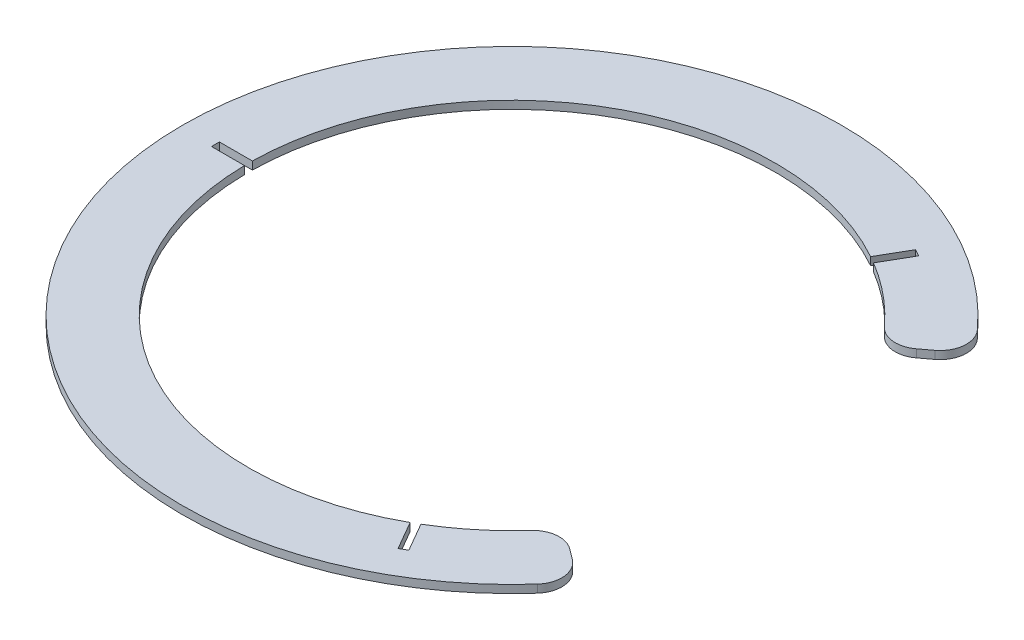
ISO-10303-21;
HEADER;
FILE_DESCRIPTION(('STEP AP214'),'2;1');
FILE_NAME('part.step','',(''),(''),'','','');
FILE_SCHEMA(('AUTOMOTIVE_DESIGN { 1 0 10303 214 1 1 1 1 }'));
ENDSEC;
DATA;
#1=APPLICATION_CONTEXT('core data for automotive mechanical design processes');
#2=APPLICATION_PROTOCOL_DEFINITION('international standard','automotive_design',2000,#1);
#3=PRODUCT_CONTEXT('',#1,'mechanical');
#4=PRODUCT('Part','Part','',(#3));
#5=PRODUCT_RELATED_PRODUCT_CATEGORY('part','',(#4));
#6=PRODUCT_DEFINITION_FORMATION('','',#4);
#7=PRODUCT_DEFINITION_CONTEXT('part definition',#1,'design');
#8=PRODUCT_DEFINITION('design','',#6,#7);
#9=PRODUCT_DEFINITION_SHAPE('','',#8);
#10=(LENGTH_UNIT() NAMED_UNIT(*) SI_UNIT(.MILLI.,.METRE.));
#11=(NAMED_UNIT(*) PLANE_ANGLE_UNIT() SI_UNIT($,.RADIAN.));
#12=(NAMED_UNIT(*) SI_UNIT($,.STERADIAN.) SOLID_ANGLE_UNIT());
#13=UNCERTAINTY_MEASURE_WITH_UNIT(LENGTH_MEASURE(1.E-05),#10,'distance_accuracy_value','');
#14=(GEOMETRIC_REPRESENTATION_CONTEXT(3) GLOBAL_UNCERTAINTY_ASSIGNED_CONTEXT((#13)) GLOBAL_UNIT_ASSIGNED_CONTEXT((#10,
#11,#12)) REPRESENTATION_CONTEXT('',''));
#15=CARTESIAN_POINT('',(0.,0.,0.));
#16=DIRECTION('',(0.,0.,1.));
#17=DIRECTION('',(1.,0.,0.));
#18=AXIS2_PLACEMENT_3D('',#15,#16,#17);
#19=CARTESIAN_POINT('',(0.,0.,0.));
#20=DIRECTION('',(0.,1.,0.));
#21=DIRECTION('',(0.,0.,1.));
#22=AXIS2_PLACEMENT_3D('',#19,#20,#21);
#23=CYLINDRICAL_SURFACE('',#22,100.);
#24=CARTESIAN_POINT('',(0.,0.,0.));
#25=DIRECTION('',(0.,1.,0.));
#26=DIRECTION('',(0.,0.,1.));
#27=AXIS2_PLACEMENT_3D('',#24,#25,#26);
#28=CIRCLE('',#27,100.);
#29=CARTESIAN_POINT('',(74.2141901825696,0.,-67.0242790005636));
#30=VERTEX_POINT('',#29);
#31=CARTESIAN_POINT('',(51.293412789234,0.,-85.8427970445584));
#32=VERTEX_POINT('',#31);
#33=EDGE_CURVE('E256',#30,#32,#28,.T.);
#34=ORIENTED_EDGE('',*,*,#33,.F.);
#35=DIRECTION('',(0.,1.,0.));
#36=VECTOR('',#35,1.);
#37=CARTESIAN_POINT('',(74.2141901825696,0.,-67.0242790005636));
#38=LINE('',#37,#36);
#39=CARTESIAN_POINT('',(74.2141901825696,3.,-67.0242790005636));
#40=VERTEX_POINT('',#39);
#41=EDGE_CURVE('E11',#30,#40,#38,.T.);
#42=ORIENTED_EDGE('',*,*,#41,.T.);
#43=CARTESIAN_POINT('',(0.,3.,0.));
#44=DIRECTION('',(0.,1.,0.));
#45=DIRECTION('',(0.,0.,1.));
#46=AXIS2_PLACEMENT_3D('',#43,#44,#45);
#47=CIRCLE('',#46,100.);
#48=CARTESIAN_POINT('',(51.293412789234,3.,-85.8427970445584));
#49=VERTEX_POINT('',#48);
#50=EDGE_CURVE('E262',#40,#49,#47,.T.);
#51=ORIENTED_EDGE('',*,*,#50,.T.);
#52=DIRECTION('',(0.,1.,0.));
#53=VECTOR('',#52,1.);
#54=CARTESIAN_POINT('',(51.293412789234,0.,-85.8427970445584));
#55=LINE('',#54,#53);
#56=EDGE_CURVE('E277',#49,#32,#55,.F.);
#57=ORIENTED_EDGE('',*,*,#56,.T.);
#58=EDGE_LOOP('',(#34,#42,#51,#57));
#59=FACE_BOUND('',#58,.T.);
#60=ADVANCED_FACE('F33',(#59),#23,.F.);
#61=CARTESIAN_POINT('',(-99.9887493671163,3.,1.5));
#62=VERTEX_POINT('',#61);
#63=CARTESIAN_POINT('',(48.6953365778819,3.,87.3427970445577));
#64=VERTEX_POINT('',#63);
#65=EDGE_CURVE('E257',#62,#64,#47,.T.);
#66=ORIENTED_EDGE('',*,*,#65,.T.);
#67=DIRECTION('',(0.,1.,0.));
#68=VECTOR('',#67,1.);
#69=CARTESIAN_POINT('',(48.6953365778819,0.,87.3427970445577));
#70=LINE('',#69,#68);
#71=CARTESIAN_POINT('',(48.6953365778819,0.,87.3427970445577));
#72=VERTEX_POINT('',#71);
#73=EDGE_CURVE('E281',#64,#72,#70,.F.);
#74=ORIENTED_EDGE('',*,*,#73,.T.);
#75=CARTESIAN_POINT('',(-99.9887493671163,0.,1.5));
#76=VERTEX_POINT('',#75);
#77=EDGE_CURVE('E252',#76,#72,#28,.T.);
#78=ORIENTED_EDGE('',*,*,#77,.F.);
#79=DIRECTION('',(0.,1.,0.));
#80=VECTOR('',#79,1.);
#81=CARTESIAN_POINT('',(-99.9887493671163,0.,1.5));
#82=LINE('',#81,#80);
#83=EDGE_CURVE('E266',#76,#62,#82,.T.);
#84=ORIENTED_EDGE('',*,*,#83,.T.);
#85=EDGE_LOOP('',(#66,#74,#78,#84));
#86=FACE_BOUND('',#85,.T.);
#87=ADVANCED_FACE('F380',(#86),#23,.F.);
#88=CARTESIAN_POINT('',(51.2934127892352,3.,85.8427970445577));
#89=VERTEX_POINT('',#88);
#90=CARTESIAN_POINT('',(74.2073939229752,3.,67.0318035499596));
#91=VERTEX_POINT('',#90);
#92=EDGE_CURVE('E261',#89,#91,#47,.T.);
#93=ORIENTED_EDGE('',*,*,#92,.T.);
#94=DIRECTION('',(0.,1.,0.));
#95=VECTOR('',#94,1.);
#96=CARTESIAN_POINT('',(74.2073939229752,0.,67.0318035499596));
#97=LINE('',#96,#95);
#98=CARTESIAN_POINT('',(74.2073939229752,0.,67.0318035499596));
#99=VERTEX_POINT('',#98);
#100=EDGE_CURVE('E297',#91,#99,#97,.F.);
#101=ORIENTED_EDGE('',*,*,#100,.T.);
#102=CARTESIAN_POINT('',(51.2934127892352,0.,85.8427970445577));
#103=VERTEX_POINT('',#102);
#104=EDGE_CURVE('E255',#103,#99,#28,.T.);
#105=ORIENTED_EDGE('',*,*,#104,.F.);
#106=DIRECTION('',(0.,1.,0.));
#107=VECTOR('',#106,1.);
#108=CARTESIAN_POINT('',(51.2934127892352,0.,85.8427970445577));
#109=LINE('',#108,#107);
#110=EDGE_CURVE('E190',#103,#89,#109,.T.);
#111=ORIENTED_EDGE('',*,*,#110,.T.);
#112=EDGE_LOOP('',(#93,#101,#105,#111));
#113=FACE_BOUND('',#112,.T.);
#114=ADVANCED_FACE('F387',(#113),#23,.F.);
#115=CARTESIAN_POINT('',(0.,3.,0.));
#116=DIRECTION('',(0.,-1.,0.));
#117=DIRECTION('',(0.,0.,-1.));
#118=AXIS2_PLACEMENT_3D('',#115,#116,#117);
#119=CYLINDRICAL_SURFACE('',#118,125.);
#120=CARTESIAN_POINT('',(0.,0.,0.));
#121=DIRECTION('',(0.,1.,0.));
#122=DIRECTION('',(0.,0.,1.));
#123=AXIS2_PLACEMENT_3D('',#120,#121,#122);
#124=CIRCLE('',#123,125.);
#125=CARTESIAN_POINT('',(93.0994716294748,0.,-83.4115602438452));
#126=VERTEX_POINT('',#125);
#127=CARTESIAN_POINT('',(93.0871330036378,0.,83.4253299014337));
#128=VERTEX_POINT('',#127);
#129=EDGE_CURVE('E254',#126,#128,#124,.T.);
#130=ORIENTED_EDGE('',*,*,#129,.T.);
#131=DIRECTION('',(0.,-1.,0.));
#132=VECTOR('',#131,1.);
#133=CARTESIAN_POINT('',(93.0871330036378,3.,83.4253299014337));
#134=LINE('',#133,#132);
#135=CARTESIAN_POINT('',(93.0871330036378,3.,83.4253299014337));
#136=VERTEX_POINT('',#135);
#137=EDGE_CURVE('E308',#128,#136,#134,.F.);
#138=ORIENTED_EDGE('',*,*,#137,.T.);
#139=CARTESIAN_POINT('',(0.,3.,0.));
#140=DIRECTION('',(0.,1.,0.));
#141=DIRECTION('',(0.,0.,1.));
#142=AXIS2_PLACEMENT_3D('',#139,#140,#141);
#143=CIRCLE('',#142,125.);
#144=CARTESIAN_POINT('',(93.0994716294748,3.,-83.4115602438452));
#145=VERTEX_POINT('',#144);
#146=EDGE_CURVE('E263',#145,#136,#143,.T.);
#147=ORIENTED_EDGE('',*,*,#146,.F.);
#148=DIRECTION('',(0.,-1.,0.));
#149=VECTOR('',#148,1.);
#150=CARTESIAN_POINT('',(93.0994716294748,3.,-83.4115602438452));
#151=LINE('',#150,#149);
#152=EDGE_CURVE('E306',#145,#126,#151,.T.);
#153=ORIENTED_EDGE('',*,*,#152,.T.);
#154=EDGE_LOOP('',(#130,#138,#147,#153));
#155=FACE_BOUND('',#154,.T.);
#156=ADVANCED_FACE('F370',(#155),#119,.T.);
#157=CARTESIAN_POINT('',(0.,3.,0.));
#158=DIRECTION('',(0.,1.,0.));
#159=DIRECTION('',(0.,0.,1.));
#160=AXIS2_PLACEMENT_3D('',#157,#158,#159);
#161=PLANE('',#160);
#162=DIRECTION('',(0.799301578633206,0.,0.600930101088691));
#163=VECTOR('',#162,1.);
#164=CARTESIAN_POINT('',(80.,3.,60.));
#165=LINE('',#164,#163);
#166=CARTESIAN_POINT('',(87.6374343261596,3.,65.7419681186235));
#167=VERTEX_POINT('',#166);
#168=CARTESIAN_POINT('',(91.6494633742337,3.,68.7582877229869));
#169=VERTEX_POINT('',#168);
#170=EDGE_CURVE('E323',#167,#169,#165,.T.);
#171=ORIENTED_EDGE('',*,*,#170,.F.);
#172=CARTESIAN_POINT('',(81.6281333152727,3.,73.7349839049556));
#173=DIRECTION('',(0.,1.,0.));
#174=DIRECTION('',(0.,0.,1.));
#175=AXIS2_PLACEMENT_3D('',#172,#173,#174);
#176=CIRCLE('',#175,10.);
#177=EDGE_CURVE('E295',#167,#91,#176,.T.);
#178=ORIENTED_EDGE('',*,*,#177,.T.);
#179=ORIENTED_EDGE('',*,*,#92,.F.);
#180=DIRECTION('',(-0.500000000000004,0.,-0.866025403784436));
#181=VECTOR('',#180,1.);
#182=CARTESIAN_POINT('',(45.049038105677,3.,75.0272228311382));
#183=LINE('',#182,#181);
#184=CARTESIAN_POINT('',(57.5490381056771,3.,96.6778579257491));
#185=VERTEX_POINT('',#184);
#186=EDGE_CURVE('E198',#185,#89,#183,.T.);
#187=ORIENTED_EDGE('',*,*,#186,.F.);
#188=DIRECTION('',(0.866025403784436,0.,-0.500000000000004));
#189=VECTOR('',#188,1.);
#190=CARTESIAN_POINT('',(57.5490381056771,3.,96.6778579257491));
#191=LINE('',#190,#189);
#192=CARTESIAN_POINT('',(54.9509618943238,3.,98.1778579257491));
#193=VERTEX_POINT('',#192);
#194=EDGE_CURVE('E180',#193,#185,#191,.T.);
#195=ORIENTED_EDGE('',*,*,#194,.F.);
#196=DIRECTION('',(0.500000000000004,0.,0.866025403784436));
#197=VECTOR('',#196,1.);
#198=CARTESIAN_POINT('',(42.4509618943237,3.,76.5272228311382));
#199=LINE('',#198,#197);
#200=EDGE_CURVE('E196',#64,#193,#199,.T.);
#201=ORIENTED_EDGE('',*,*,#200,.F.);
#202=ORIENTED_EDGE('',*,*,#65,.F.);
#203=DIRECTION('',(1.,0.,0.));
#204=VECTOR('',#203,1.);
#205=CARTESIAN_POINT('',(-87.5,3.,1.5));
#206=LINE('',#205,#204);
#207=CARTESIAN_POINT('',(-112.5,3.,1.5));
#208=VERTEX_POINT('',#207);
#209=EDGE_CURVE('E244',#208,#62,#206,.T.);
#210=ORIENTED_EDGE('',*,*,#209,.F.);
#211=DIRECTION('',(0.,0.,1.));
#212=VECTOR('',#211,1.);
#213=CARTESIAN_POINT('',(-112.5,3.,1.5));
#214=LINE('',#213,#212);
#215=CARTESIAN_POINT('',(-112.5,3.,-1.5));
#216=VERTEX_POINT('',#215);
#217=EDGE_CURVE('E208',#216,#208,#214,.T.);
#218=ORIENTED_EDGE('',*,*,#217,.F.);
#219=DIRECTION('',(-1.,0.,0.));
#220=VECTOR('',#219,1.);
#221=CARTESIAN_POINT('',(-87.5,3.,-1.5));
#222=LINE('',#221,#220);
#223=CARTESIAN_POINT('',(-99.9887493671163,3.,-1.5));
#224=VERTEX_POINT('',#223);
#225=EDGE_CURVE('E235',#224,#216,#222,.T.);
#226=ORIENTED_EDGE('',*,*,#225,.F.);
#227=CARTESIAN_POINT('',(48.6953365778807,3.,-87.3427970445584));
#228=VERTEX_POINT('',#227);
#229=EDGE_CURVE('E250',#228,#224,#47,.T.);
#230=ORIENTED_EDGE('',*,*,#229,.F.);
#231=DIRECTION('',(-0.499999999999992,0.,0.866025403784443));
#232=VECTOR('',#231,1.);
#233=CARTESIAN_POINT('',(42.4509618943226,3.,-76.5272228311388));
#234=LINE('',#233,#232);
#235=CARTESIAN_POINT('',(54.9509618943224,3.,-98.1778579257499));
#236=VERTEX_POINT('',#235);
#237=EDGE_CURVE('E224',#236,#228,#234,.T.);
#238=ORIENTED_EDGE('',*,*,#237,.F.);
#239=DIRECTION('',(-0.866025403784443,0.,-0.499999999999992));
#240=VECTOR('',#239,1.);
#241=CARTESIAN_POINT('',(54.9509618943224,3.,-98.1778579257499));
#242=LINE('',#241,#240);
#243=CARTESIAN_POINT('',(57.5490381056758,3.,-96.6778579257499));
#244=VERTEX_POINT('',#243);
#245=EDGE_CURVE('E221',#244,#236,#242,.T.);
#246=ORIENTED_EDGE('',*,*,#245,.F.);
#247=DIRECTION('',(0.499999999999992,0.,-0.866025403784443));
#248=VECTOR('',#247,1.);
#249=CARTESIAN_POINT('',(45.049038105676,3.,-75.0272228311388));
#250=LINE('',#249,#248);
#251=EDGE_CURVE('E214',#49,#244,#250,.T.);
#252=ORIENTED_EDGE('',*,*,#251,.F.);
#253=ORIENTED_EDGE('',*,*,#50,.F.);
#254=CARTESIAN_POINT('',(81.6356092008266,3.,-73.7267069006199));
#255=DIRECTION('',(0.,1.,0.));
#256=DIRECTION('',(0.,0.,1.));
#257=AXIS2_PLACEMENT_3D('',#254,#255,#256);
#258=CIRCLE('',#257,10.);
#259=CARTESIAN_POINT('',(87.6356092008266,3.,-65.7267069006199));
#260=VERTEX_POINT('',#259);
#261=EDGE_CURVE('E289',#40,#260,#258,.T.);
#262=ORIENTED_EDGE('',*,*,#261,.T.);
#263=DIRECTION('',(-0.8,0.,0.6));
#264=VECTOR('',#263,1.);
#265=CARTESIAN_POINT('',(80.,3.,-60.));
#266=LINE('',#265,#264);
#267=CARTESIAN_POINT('',(91.6515138991168,3.,-68.7386354243376));
#268=VERTEX_POINT('',#267);
#269=EDGE_CURVE('E201',#268,#260,#266,.T.);
#270=ORIENTED_EDGE('',*,*,#269,.F.);
#271=CARTESIAN_POINT('',(85.6515138991168,3.,-76.7386354243376));
#272=DIRECTION('',(0.,1.,0.));
#273=DIRECTION('',(0.,0.,1.));
#274=AXIS2_PLACEMENT_3D('',#271,#272,#273);
#275=CIRCLE('',#274,10.);
#276=EDGE_CURVE('E291',#268,#145,#275,.T.);
#277=ORIENTED_EDGE('',*,*,#276,.T.);
#278=ORIENTED_EDGE('',*,*,#146,.T.);
#279=CARTESIAN_POINT('',(85.6401623633468,3.,76.751303509319));
#280=DIRECTION('',(0.,1.,0.));
#281=DIRECTION('',(0.,0.,1.));
#282=AXIS2_PLACEMENT_3D('',#279,#280,#281);
#283=CIRCLE('',#282,10.);
#284=EDGE_CURVE('E293',#136,#169,#283,.T.);
#285=ORIENTED_EDGE('',*,*,#284,.T.);
#286=EDGE_LOOP('',(#171,#178,#179,#187,#195,#201,#202,#210,#218,#226,#230,#238,#246,#252,#253,
#262,#270,#277,#278,#285));
#287=FACE_BOUND('',#286,.T.);
#288=ADVANCED_FACE('F319',(#287),#161,.T.);
#289=CARTESIAN_POINT('',(0.,0.,0.));
#290=DIRECTION('',(0.,1.,0.));
#291=DIRECTION('',(0.,0.,1.));
#292=AXIS2_PLACEMENT_3D('',#289,#290,#291);
#293=PLANE('',#292);
#294=ORIENTED_EDGE('',*,*,#104,.T.);
#295=CARTESIAN_POINT('',(81.6281333152727,0.,73.7349839049556));
#296=DIRECTION('',(0.,1.,0.));
#297=DIRECTION('',(0.,0.,1.));
#298=AXIS2_PLACEMENT_3D('',#295,#296,#297);
#299=CIRCLE('',#298,10.);
#300=CARTESIAN_POINT('',(87.6374343261596,0.,65.7419681186235));
#301=VERTEX_POINT('',#300);
#302=EDGE_CURVE('E304',#99,#301,#299,.F.);
#303=ORIENTED_EDGE('',*,*,#302,.T.);
#304=DIRECTION('',(0.799301578633206,0.,0.600930101088691));
#305=VECTOR('',#304,1.);
#306=CARTESIAN_POINT('',(80.,0.,60.));
#307=LINE('',#306,#305);
#308=CARTESIAN_POINT('',(91.6494633742337,0.,68.7582877229869));
#309=VERTEX_POINT('',#308);
#310=EDGE_CURVE('E322',#301,#309,#307,.T.);
#311=ORIENTED_EDGE('',*,*,#310,.T.);
#312=CARTESIAN_POINT('',(85.6401623633468,0.,76.751303509319));
#313=DIRECTION('',(0.,1.,0.));
#314=DIRECTION('',(0.,0.,1.));
#315=AXIS2_PLACEMENT_3D('',#312,#313,#314);
#316=CIRCLE('',#315,10.);
#317=EDGE_CURVE('E302',#309,#128,#316,.F.);
#318=ORIENTED_EDGE('',*,*,#317,.T.);
#319=ORIENTED_EDGE('',*,*,#129,.F.);
#320=CARTESIAN_POINT('',(85.6515138991168,0.,-76.7386354243376));
#321=DIRECTION('',(0.,1.,0.));
#322=DIRECTION('',(0.,0.,1.));
#323=AXIS2_PLACEMENT_3D('',#320,#321,#322);
#324=CIRCLE('',#323,10.);
#325=CARTESIAN_POINT('',(91.6515138991168,0.,-68.7386354243376));
#326=VERTEX_POINT('',#325);
#327=EDGE_CURVE('E300',#126,#326,#324,.F.);
#328=ORIENTED_EDGE('',*,*,#327,.T.);
#329=DIRECTION('',(-0.8,0.,0.6));
#330=VECTOR('',#329,1.);
#331=CARTESIAN_POINT('',(80.,0.,-60.));
#332=LINE('',#331,#330);
#333=CARTESIAN_POINT('',(87.6356092008266,0.,-65.7267069006199));
#334=VERTEX_POINT('',#333);
#335=EDGE_CURVE('E225',#326,#334,#332,.T.);
#336=ORIENTED_EDGE('',*,*,#335,.T.);
#337=CARTESIAN_POINT('',(81.6356092008266,0.,-73.7267069006199));
#338=DIRECTION('',(0.,1.,0.));
#339=DIRECTION('',(0.,0.,1.));
#340=AXIS2_PLACEMENT_3D('',#337,#338,#339);
#341=CIRCLE('',#340,10.);
#342=EDGE_CURVE('E48',#334,#30,#341,.F.);
#343=ORIENTED_EDGE('',*,*,#342,.T.);
#344=ORIENTED_EDGE('',*,*,#33,.T.);
#345=DIRECTION('',(0.499999999999992,0.,-0.866025403784443));
#346=VECTOR('',#345,1.);
#347=CARTESIAN_POINT('',(45.049038105676,0.,-75.0272228311388));
#348=LINE('',#347,#346);
#349=CARTESIAN_POINT('',(57.5490381056758,0.,-96.6778579257499));
#350=VERTEX_POINT('',#349);
#351=EDGE_CURVE('E217',#32,#350,#348,.T.);
#352=ORIENTED_EDGE('',*,*,#351,.T.);
#353=DIRECTION('',(-0.866025403784443,0.,-0.499999999999992));
#354=VECTOR('',#353,1.);
#355=CARTESIAN_POINT('',(54.9509618943224,0.,-98.1778579257499));
#356=LINE('',#355,#354);
#357=CARTESIAN_POINT('',(54.9509618943224,0.,-98.1778579257499));
#358=VERTEX_POINT('',#357);
#359=EDGE_CURVE('E210',#350,#358,#356,.T.);
#360=ORIENTED_EDGE('',*,*,#359,.T.);
#361=DIRECTION('',(-0.499999999999992,0.,0.866025403784443));
#362=VECTOR('',#361,1.);
#363=CARTESIAN_POINT('',(42.4509618943226,0.,-76.5272228311388));
#364=LINE('',#363,#362);
#365=CARTESIAN_POINT('',(48.6953365778807,0.,-87.3427970445584));
#366=VERTEX_POINT('',#365);
#367=EDGE_CURVE('E213',#358,#366,#364,.T.);
#368=ORIENTED_EDGE('',*,*,#367,.T.);
#369=CARTESIAN_POINT('',(-99.9887493671163,0.,-1.5));
#370=VERTEX_POINT('',#369);
#371=EDGE_CURVE('E260',#366,#370,#28,.T.);
#372=ORIENTED_EDGE('',*,*,#371,.T.);
#373=DIRECTION('',(-1.,0.,0.));
#374=VECTOR('',#373,1.);
#375=CARTESIAN_POINT('',(-87.5,0.,-1.5));
#376=LINE('',#375,#374);
#377=CARTESIAN_POINT('',(-112.5,0.,-1.5));
#378=VERTEX_POINT('',#377);
#379=EDGE_CURVE('E238',#370,#378,#376,.T.);
#380=ORIENTED_EDGE('',*,*,#379,.T.);
#381=DIRECTION('',(0.,0.,1.));
#382=VECTOR('',#381,1.);
#383=CARTESIAN_POINT('',(-112.5,0.,1.5));
#384=LINE('',#383,#382);
#385=CARTESIAN_POINT('',(-112.5,0.,1.5));
#386=VERTEX_POINT('',#385);
#387=EDGE_CURVE('E231',#378,#386,#384,.T.);
#388=ORIENTED_EDGE('',*,*,#387,.T.);
#389=DIRECTION('',(1.,0.,0.));
#390=VECTOR('',#389,1.);
#391=CARTESIAN_POINT('',(-87.5,0.,1.5));
#392=LINE('',#391,#390);
#393=EDGE_CURVE('E234',#386,#76,#392,.T.);
#394=ORIENTED_EDGE('',*,*,#393,.T.);
#395=ORIENTED_EDGE('',*,*,#77,.T.);
#396=DIRECTION('',(0.500000000000004,0.,0.866025403784436));
#397=VECTOR('',#396,1.);
#398=CARTESIAN_POINT('',(42.4509618943237,0.,76.5272228311382));
#399=LINE('',#398,#397);
#400=CARTESIAN_POINT('',(54.9509618943238,0.,98.1778579257491));
#401=VERTEX_POINT('',#400);
#402=EDGE_CURVE('E184',#72,#401,#399,.T.);
#403=ORIENTED_EDGE('',*,*,#402,.T.);
#404=DIRECTION('',(0.866025403784436,0.,-0.500000000000004));
#405=VECTOR('',#404,1.);
#406=CARTESIAN_POINT('',(57.5490381056771,0.,96.6778579257491));
#407=LINE('',#406,#405);
#408=CARTESIAN_POINT('',(57.5490381056771,0.,96.6778579257491));
#409=VERTEX_POINT('',#408);
#410=EDGE_CURVE('E177',#401,#409,#407,.T.);
#411=ORIENTED_EDGE('',*,*,#410,.T.);
#412=DIRECTION('',(-0.500000000000004,0.,-0.866025403784436));
#413=VECTOR('',#412,1.);
#414=CARTESIAN_POINT('',(45.049038105677,0.,75.0272228311382));
#415=LINE('',#414,#413);
#416=EDGE_CURVE('E187',#409,#103,#415,.T.);
#417=ORIENTED_EDGE('',*,*,#416,.T.);
#418=EDGE_LOOP('',(#294,#303,#311,#318,#319,#328,#336,#343,#344,#352,#360,#368,#372,#380,#388,
#394,#395,#403,#411,#417));
#419=FACE_BOUND('',#418,.T.);
#420=ADVANCED_FACE('F194',(#419),#293,.F.);
#421=ORIENTED_EDGE('',*,*,#371,.F.);
#422=DIRECTION('',(0.,1.,0.));
#423=VECTOR('',#422,1.);
#424=CARTESIAN_POINT('',(48.6953365778807,0.,-87.3427970445584));
#425=LINE('',#424,#423);
#426=EDGE_CURVE('E274',#366,#228,#425,.T.);
#427=ORIENTED_EDGE('',*,*,#426,.T.);
#428=ORIENTED_EDGE('',*,*,#229,.T.);
#429=DIRECTION('',(0.,1.,0.));
#430=VECTOR('',#429,1.);
#431=CARTESIAN_POINT('',(-99.9887493671163,0.,-1.5));
#432=LINE('',#431,#430);
#433=EDGE_CURVE('E271',#224,#370,#432,.F.);
#434=ORIENTED_EDGE('',*,*,#433,.T.);
#435=EDGE_LOOP('',(#421,#427,#428,#434));
#436=FACE_BOUND('',#435,.T.);
#437=ADVANCED_FACE('F342',(#436),#23,.F.);
#438=CARTESIAN_POINT('',(-87.5,0.,-1.5));
#439=DIRECTION('',(0.,0.,-1.));
#440=DIRECTION('',(-1.,0.,0.));
#441=AXIS2_PLACEMENT_3D('',#438,#439,#440);
#442=PLANE('',#441);
#443=ORIENTED_EDGE('',*,*,#225,.T.);
#444=DIRECTION('',(0.,1.,0.));
#445=VECTOR('',#444,1.);
#446=CARTESIAN_POINT('',(-112.5,0.,-1.5));
#447=LINE('',#446,#445);
#448=EDGE_CURVE('E247',#378,#216,#447,.T.);
#449=ORIENTED_EDGE('',*,*,#448,.F.);
#450=ORIENTED_EDGE('',*,*,#379,.F.);
#451=ORIENTED_EDGE('',*,*,#433,.F.);
#452=EDGE_LOOP('',(#443,#449,#450,#451));
#453=FACE_BOUND('',#452,.T.);
#454=ADVANCED_FACE('F347',(#453),#442,.F.);
#455=CARTESIAN_POINT('',(-87.5,0.,1.5));
#456=DIRECTION('',(0.,0.,1.));
#457=DIRECTION('',(1.,0.,0.));
#458=AXIS2_PLACEMENT_3D('',#455,#456,#457);
#459=PLANE('',#458);
#460=ORIENTED_EDGE('',*,*,#393,.F.);
#461=DIRECTION('',(0.,1.,0.));
#462=VECTOR('',#461,1.);
#463=CARTESIAN_POINT('',(-112.5,0.,1.5));
#464=LINE('',#463,#462);
#465=EDGE_CURVE('E241',#386,#208,#464,.T.);
#466=ORIENTED_EDGE('',*,*,#465,.T.);
#467=ORIENTED_EDGE('',*,*,#209,.T.);
#468=ORIENTED_EDGE('',*,*,#83,.F.);
#469=EDGE_LOOP('',(#460,#466,#467,#468));
#470=FACE_BOUND('',#469,.T.);
#471=ADVANCED_FACE('F396',(#470),#459,.F.);
#472=CARTESIAN_POINT('',(-112.5,0.,1.5));
#473=DIRECTION('',(-1.,0.,0.));
#474=DIRECTION('',(0.,0.,1.));
#475=AXIS2_PLACEMENT_3D('',#472,#473,#474);
#476=PLANE('',#475);
#477=ORIENTED_EDGE('',*,*,#217,.T.);
#478=ORIENTED_EDGE('',*,*,#465,.F.);
#479=ORIENTED_EDGE('',*,*,#387,.F.);
#480=ORIENTED_EDGE('',*,*,#448,.T.);
#481=EDGE_LOOP('',(#477,#478,#479,#480));
#482=FACE_BOUND('',#481,.T.);
#483=ADVANCED_FACE('F352',(#482),#476,.F.);
#484=CARTESIAN_POINT('',(45.049038105676,0.,-75.0272228311388));
#485=DIRECTION('',(0.866025403784443,0.,0.499999999999992));
#486=DIRECTION('',(0.499999999999992,0.,-0.866025403784443));
#487=AXIS2_PLACEMENT_3D('',#484,#485,#486);
#488=PLANE('',#487);
#489=ORIENTED_EDGE('',*,*,#251,.T.);
#490=DIRECTION('',(0.,1.,0.));
#491=VECTOR('',#490,1.);
#492=CARTESIAN_POINT('',(57.5490381056758,0.,-96.6778579257499));
#493=LINE('',#492,#491);
#494=EDGE_CURVE('E206',#350,#244,#493,.T.);
#495=ORIENTED_EDGE('',*,*,#494,.F.);
#496=ORIENTED_EDGE('',*,*,#351,.F.);
#497=ORIENTED_EDGE('',*,*,#56,.F.);
#498=EDGE_LOOP('',(#489,#495,#496,#497));
#499=FACE_BOUND('',#498,.T.);
#500=ADVANCED_FACE('F413',(#499),#488,.F.);
#501=CARTESIAN_POINT('',(42.4509618943226,0.,-76.5272228311388));
#502=DIRECTION('',(-0.866025403784443,0.,-0.499999999999992));
#503=DIRECTION('',(-0.499999999999992,0.,0.866025403784443));
#504=AXIS2_PLACEMENT_3D('',#501,#502,#503);
#505=PLANE('',#504);
#506=ORIENTED_EDGE('',*,*,#367,.F.);
#507=DIRECTION('',(0.,1.,0.));
#508=VECTOR('',#507,1.);
#509=CARTESIAN_POINT('',(54.9509618943224,0.,-98.1778579257499));
#510=LINE('',#509,#508);
#511=EDGE_CURVE('E220',#358,#236,#510,.T.);
#512=ORIENTED_EDGE('',*,*,#511,.T.);
#513=ORIENTED_EDGE('',*,*,#237,.T.);
#514=ORIENTED_EDGE('',*,*,#426,.F.);
#515=EDGE_LOOP('',(#506,#512,#513,#514));
#516=FACE_BOUND('',#515,.T.);
#517=ADVANCED_FACE('F419',(#516),#505,.F.);
#518=CARTESIAN_POINT('',(54.9509618943224,0.,-98.1778579257499));
#519=DIRECTION('',(0.499999999999992,0.,-0.866025403784443));
#520=DIRECTION('',(-0.866025403784443,0.,-0.499999999999992));
#521=AXIS2_PLACEMENT_3D('',#518,#519,#520);
#522=PLANE('',#521);
#523=ORIENTED_EDGE('',*,*,#245,.T.);
#524=ORIENTED_EDGE('',*,*,#511,.F.);
#525=ORIENTED_EDGE('',*,*,#359,.F.);
#526=ORIENTED_EDGE('',*,*,#494,.T.);
#527=EDGE_LOOP('',(#523,#524,#525,#526));
#528=FACE_BOUND('',#527,.T.);
#529=ADVANCED_FACE('F415',(#528),#522,.F.);
#530=CARTESIAN_POINT('',(42.4509618943237,0.,76.5272228311382));
#531=DIRECTION('',(-0.866025403784436,0.,0.500000000000004));
#532=DIRECTION('',(0.500000000000004,0.,0.866025403784436));
#533=AXIS2_PLACEMENT_3D('',#530,#531,#532);
#534=PLANE('',#533);
#535=ORIENTED_EDGE('',*,*,#200,.T.);
#536=DIRECTION('',(0.,1.,0.));
#537=VECTOR('',#536,1.);
#538=CARTESIAN_POINT('',(54.9509618943238,0.,98.1778579257491));
#539=LINE('',#538,#537);
#540=EDGE_CURVE('E183',#401,#193,#539,.T.);
#541=ORIENTED_EDGE('',*,*,#540,.F.);
#542=ORIENTED_EDGE('',*,*,#402,.F.);
#543=ORIENTED_EDGE('',*,*,#73,.F.);
#544=EDGE_LOOP('',(#535,#541,#542,#543));
#545=FACE_BOUND('',#544,.T.);
#546=ADVANCED_FACE('F418',(#545),#534,.F.);
#547=CARTESIAN_POINT('',(45.049038105677,0.,75.0272228311382));
#548=DIRECTION('',(0.866025403784436,0.,-0.500000000000004));
#549=DIRECTION('',(-0.500000000000004,0.,-0.866025403784436));
#550=AXIS2_PLACEMENT_3D('',#547,#548,#549);
#551=PLANE('',#550);
#552=ORIENTED_EDGE('',*,*,#416,.F.);
#553=DIRECTION('',(0.,1.,0.));
#554=VECTOR('',#553,1.);
#555=CARTESIAN_POINT('',(57.5490381056771,0.,96.6778579257491));
#556=LINE('',#555,#554);
#557=EDGE_CURVE('E172',#409,#185,#556,.T.);
#558=ORIENTED_EDGE('',*,*,#557,.T.);
#559=ORIENTED_EDGE('',*,*,#186,.T.);
#560=ORIENTED_EDGE('',*,*,#110,.F.);
#561=EDGE_LOOP('',(#552,#558,#559,#560));
#562=FACE_BOUND('',#561,.T.);
#563=ADVANCED_FACE('F188',(#562),#551,.F.);
#564=CARTESIAN_POINT('',(57.5490381056771,0.,96.6778579257491));
#565=DIRECTION('',(0.500000000000004,0.,0.866025403784436));
#566=DIRECTION('',(0.866025403784436,0.,-0.500000000000004));
#567=AXIS2_PLACEMENT_3D('',#564,#565,#566);
#568=PLANE('',#567);
#569=ORIENTED_EDGE('',*,*,#194,.T.);
#570=ORIENTED_EDGE('',*,*,#557,.F.);
#571=ORIENTED_EDGE('',*,*,#410,.F.);
#572=ORIENTED_EDGE('',*,*,#540,.T.);
#573=EDGE_LOOP('',(#569,#570,#571,#572));
#574=FACE_BOUND('',#573,.T.);
#575=ADVANCED_FACE('F174',(#574),#568,.F.);
#576=CARTESIAN_POINT('',(80.,0.,60.));
#577=DIRECTION('',(-0.600930101088691,0.,0.799301578633206));
#578=DIRECTION('',(0.799301578633206,0.,0.600930101088691));
#579=AXIS2_PLACEMENT_3D('',#576,#577,#578);
#580=PLANE('',#579);
#581=ORIENTED_EDGE('',*,*,#310,.F.);
#582=DIRECTION('',(0.,1.,0.));
#583=VECTOR('',#582,1.);
#584=CARTESIAN_POINT('',(87.6374343261596,0.,65.7419681186235));
#585=LINE('',#584,#583);
#586=EDGE_CURVE('E286',#301,#167,#585,.T.);
#587=ORIENTED_EDGE('',*,*,#586,.T.);
#588=ORIENTED_EDGE('',*,*,#170,.T.);
#589=DIRECTION('',(0.,-1.,0.));
#590=VECTOR('',#589,1.);
#591=CARTESIAN_POINT('',(91.6494633742337,0.,68.7582877229869));
#592=LINE('',#591,#590);
#593=EDGE_CURVE('E284',#169,#309,#592,.T.);
#594=ORIENTED_EDGE('',*,*,#593,.T.);
#595=EDGE_LOOP('',(#581,#587,#588,#594));
#596=FACE_BOUND('',#595,.T.);
#597=ADVANCED_FACE('F363',(#596),#580,.F.);
#598=CARTESIAN_POINT('',(80.,0.,-60.));
#599=DIRECTION('',(-0.6,0.,-0.8));
#600=DIRECTION('',(-0.8,0.,0.6));
#601=AXIS2_PLACEMENT_3D('',#598,#599,#600);
#602=PLANE('',#601);
#603=ORIENTED_EDGE('',*,*,#335,.F.);
#604=DIRECTION('',(0.,-1.,0.));
#605=VECTOR('',#604,1.);
#606=CARTESIAN_POINT('',(91.6515138991168,0.,-68.7386354243376));
#607=LINE('',#606,#605);
#608=EDGE_CURVE('E41',#326,#268,#607,.F.);
#609=ORIENTED_EDGE('',*,*,#608,.T.);
#610=ORIENTED_EDGE('',*,*,#269,.T.);
#611=DIRECTION('',(0.,1.,0.));
#612=VECTOR('',#611,1.);
#613=CARTESIAN_POINT('',(87.6356092008266,0.,-65.7267069006199));
#614=LINE('',#613,#612);
#615=EDGE_CURVE('E56',#260,#334,#614,.F.);
#616=ORIENTED_EDGE('',*,*,#615,.T.);
#617=EDGE_LOOP('',(#603,#609,#610,#616));
#618=FACE_BOUND('',#617,.T.);
#619=ADVANCED_FACE('F314',(#618),#602,.F.);
#620=CARTESIAN_POINT('',(81.6281333152727,0.,73.7349839049556));
#621=DIRECTION('',(0.,1.,0.));
#622=DIRECTION('',(0.,0.,1.));
#623=AXIS2_PLACEMENT_3D('',#620,#621,#622);
#624=CYLINDRICAL_SURFACE('',#623,10.);
#625=ORIENTED_EDGE('',*,*,#302,.F.);
#626=ORIENTED_EDGE('',*,*,#100,.F.);
#627=ORIENTED_EDGE('',*,*,#177,.F.);
#628=ORIENTED_EDGE('',*,*,#586,.F.);
#629=EDGE_LOOP('',(#625,#626,#627,#628));
#630=FACE_BOUND('',#629,.T.);
#631=ADVANCED_FACE('F362',(#630),#624,.T.);
#632=CARTESIAN_POINT('',(85.6401623633468,3.,76.751303509319));
#633=DIRECTION('',(0.,-1.,0.));
#634=DIRECTION('',(0.,0.,-1.));
#635=AXIS2_PLACEMENT_3D('',#632,#633,#634);
#636=CYLINDRICAL_SURFACE('',#635,10.);
#637=ORIENTED_EDGE('',*,*,#317,.F.);
#638=ORIENTED_EDGE('',*,*,#593,.F.);
#639=ORIENTED_EDGE('',*,*,#284,.F.);
#640=ORIENTED_EDGE('',*,*,#137,.F.);
#641=EDGE_LOOP('',(#637,#638,#639,#640));
#642=FACE_BOUND('',#641,.T.);
#643=ADVANCED_FACE('F368',(#642),#636,.T.);
#644=CARTESIAN_POINT('',(85.6515138991168,3.,-76.7386354243376));
#645=DIRECTION('',(0.,-1.,0.));
#646=DIRECTION('',(0.,0.,-1.));
#647=AXIS2_PLACEMENT_3D('',#644,#645,#646);
#648=CYLINDRICAL_SURFACE('',#647,10.);
#649=ORIENTED_EDGE('',*,*,#327,.F.);
#650=ORIENTED_EDGE('',*,*,#152,.F.);
#651=ORIENTED_EDGE('',*,*,#276,.F.);
#652=ORIENTED_EDGE('',*,*,#608,.F.);
#653=EDGE_LOOP('',(#649,#650,#651,#652));
#654=FACE_BOUND('',#653,.T.);
#655=ADVANCED_FACE('F372',(#654),#648,.T.);
#656=CARTESIAN_POINT('',(81.6356092008266,0.,-73.7267069006199));
#657=DIRECTION('',(0.,1.,0.));
#658=DIRECTION('',(0.,0.,1.));
#659=AXIS2_PLACEMENT_3D('',#656,#657,#658);
#660=CYLINDRICAL_SURFACE('',#659,10.);
#661=ORIENTED_EDGE('',*,*,#342,.F.);
#662=ORIENTED_EDGE('',*,*,#615,.F.);
#663=ORIENTED_EDGE('',*,*,#261,.F.);
#664=ORIENTED_EDGE('',*,*,#41,.F.);
#665=EDGE_LOOP('',(#661,#662,#663,#664));
#666=FACE_BOUND('',#665,.T.);
#667=ADVANCED_FACE('F35',(#666),#660,.T.);
#668=CLOSED_SHELL('',(#60,#87,#114,#156,#288,#420,#437,#454,#471,#483,#500,#517,#529,#546,#563,
#575,#597,#619,#631,#643,#655,#667));
#669=MANIFOLD_SOLID_BREP('B2',#668);
#670=ADVANCED_BREP_SHAPE_REPRESENTATION('',(#18,#669),#14);
#671=SHAPE_DEFINITION_REPRESENTATION(#9,#670);
ENDSEC;
END-ISO-10303-21;
